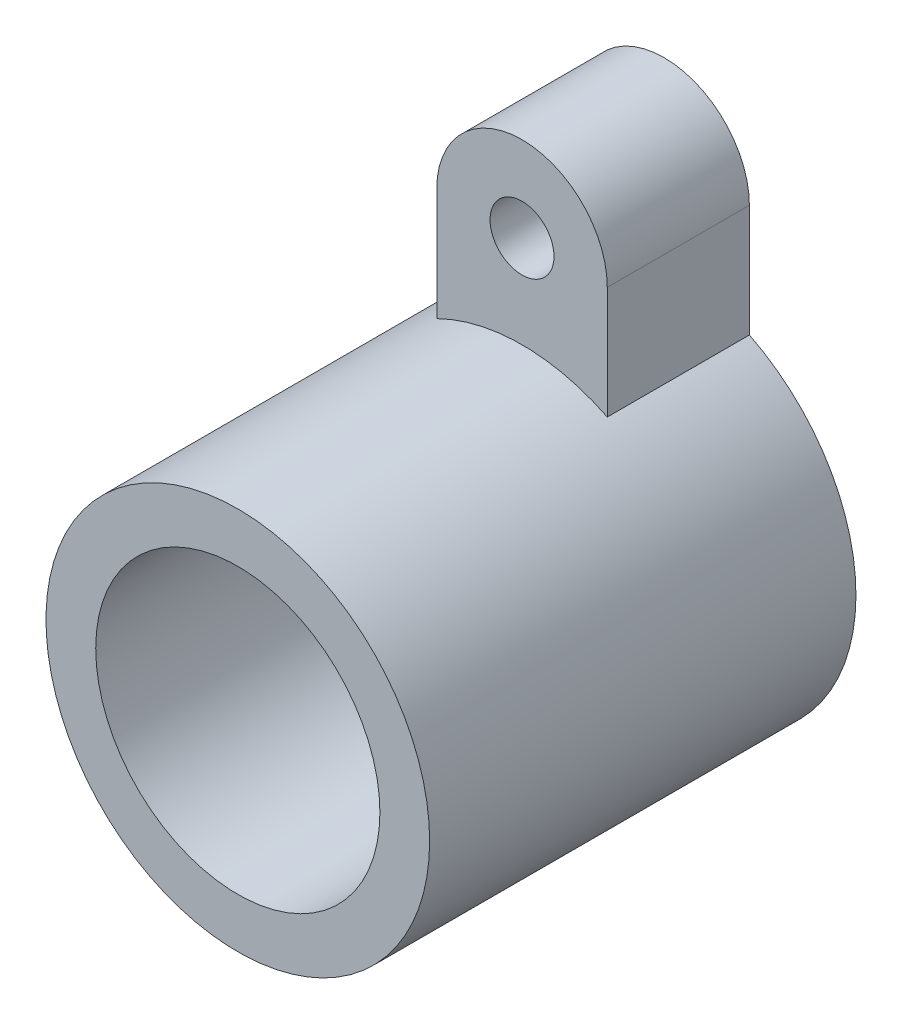
ISO-10303-21;
HEADER;
FILE_DESCRIPTION(('STEP AP214'),'2;1');
FILE_NAME('part.step','',(''),(''),'','','');
FILE_SCHEMA(('AUTOMOTIVE_DESIGN { 1 0 10303 214 1 1 1 1 }'));
ENDSEC;
DATA;
#1=APPLICATION_CONTEXT('core data for automotive mechanical design processes');
#2=APPLICATION_PROTOCOL_DEFINITION('international standard','automotive_design',2000,#1);
#3=PRODUCT_CONTEXT('',#1,'mechanical');
#4=PRODUCT('Part','Part','',(#3));
#5=PRODUCT_RELATED_PRODUCT_CATEGORY('part','',(#4));
#6=PRODUCT_DEFINITION_FORMATION('','',#4);
#7=PRODUCT_DEFINITION_CONTEXT('part definition',#1,'design');
#8=PRODUCT_DEFINITION('design','',#6,#7);
#9=PRODUCT_DEFINITION_SHAPE('','',#8);
#10=(LENGTH_UNIT() NAMED_UNIT(*) SI_UNIT(.MILLI.,.METRE.));
#11=(NAMED_UNIT(*) PLANE_ANGLE_UNIT() SI_UNIT($,.RADIAN.));
#12=(NAMED_UNIT(*) SI_UNIT($,.STERADIAN.) SOLID_ANGLE_UNIT());
#13=UNCERTAINTY_MEASURE_WITH_UNIT(LENGTH_MEASURE(1.E-05),#10,'distance_accuracy_value','');
#14=(GEOMETRIC_REPRESENTATION_CONTEXT(3) GLOBAL_UNCERTAINTY_ASSIGNED_CONTEXT((#13)) GLOBAL_UNIT_ASSIGNED_CONTEXT((#10,
#11,#12)) REPRESENTATION_CONTEXT('',''));
#15=CARTESIAN_POINT('',(0.,0.,0.));
#16=DIRECTION('',(0.,0.,1.));
#17=DIRECTION('',(1.,0.,0.));
#18=AXIS2_PLACEMENT_3D('',#15,#16,#17);
#19=CARTESIAN_POINT('',(0.,0.,60.));
#20=DIRECTION('',(0.,0.,-1.));
#21=DIRECTION('',(-1.,0.,0.));
#22=AXIS2_PLACEMENT_3D('',#19,#20,#21);
#23=CYLINDRICAL_SURFACE('',#22,27.);
#24=CARTESIAN_POINT('',(0.,0.,60.));
#25=DIRECTION('',(0.,0.,1.));
#26=DIRECTION('',(1.,0.,0.));
#27=AXIS2_PLACEMENT_3D('',#24,#25,#26);
#28=CIRCLE('',#27,27.);
#29=CARTESIAN_POINT('',(27.,0.,60.));
#30=VERTEX_POINT('',#29);
#31=EDGE_CURVE('E45',#30,#30,#28,.T.);
#32=ORIENTED_EDGE('',*,*,#31,.F.);
#33=EDGE_LOOP('',(#32));
#34=FACE_BOUND('',#33,.T.);
#35=DIRECTION('',(0.,0.,-1.));
#36=VECTOR('',#35,1.);
#37=CARTESIAN_POINT('',(12.,24.1867732448956,20.));
#38=LINE('',#37,#36);
#39=CARTESIAN_POINT('',(12.,24.1867732448956,20.));
#40=VERTEX_POINT('',#39);
#41=CARTESIAN_POINT('',(12.,24.1867732448956,0.));
#42=VERTEX_POINT('',#41);
#43=EDGE_CURVE('E58',#40,#42,#38,.T.);
#44=ORIENTED_EDGE('',*,*,#43,.F.);
#45=CARTESIAN_POINT('',(0.,0.,20.));
#46=DIRECTION('',(0.,0.,1.));
#47=DIRECTION('',(1.,0.,0.));
#48=AXIS2_PLACEMENT_3D('',#45,#46,#47);
#49=CIRCLE('',#48,27.);
#50=CARTESIAN_POINT('',(-12.,24.1867732448956,20.));
#51=VERTEX_POINT('',#50);
#52=EDGE_CURVE('E53',#40,#51,#49,.T.);
#53=ORIENTED_EDGE('',*,*,#52,.T.);
#54=DIRECTION('',(0.,0.,-1.));
#55=VECTOR('',#54,1.);
#56=CARTESIAN_POINT('',(-12.,24.1867732448956,20.));
#57=LINE('',#56,#55);
#58=CARTESIAN_POINT('',(-12.,24.1867732448956,0.));
#59=VERTEX_POINT('',#58);
#60=EDGE_CURVE('E131',#51,#59,#57,.T.);
#61=ORIENTED_EDGE('',*,*,#60,.T.);
#62=CARTESIAN_POINT('',(0.,0.,0.));
#63=DIRECTION('',(0.,0.,1.));
#64=DIRECTION('',(1.,0.,0.));
#65=AXIS2_PLACEMENT_3D('',#62,#63,#64);
#66=CIRCLE('',#65,27.);
#67=CARTESIAN_POINT('',(-24.8052156628336,-10.6630800391029,0.));
#68=VERTEX_POINT('',#67);
#69=EDGE_CURVE('E179',#59,#68,#66,.T.);
#70=ORIENTED_EDGE('',*,*,#69,.T.);
#71=DIRECTION('',(0.,0.,-1.));
#72=VECTOR('',#71,1.);
#73=CARTESIAN_POINT('',(-24.8052156628336,-10.6630800391029,20.));
#74=LINE('',#73,#72);
#75=CARTESIAN_POINT('',(-24.8052156628336,-10.6630800391029,20.));
#76=VERTEX_POINT('',#75);
#77=EDGE_CURVE('E159',#76,#68,#74,.T.);
#78=ORIENTED_EDGE('',*,*,#77,.F.);
#79=CARTESIAN_POINT('',(0.,0.,20.));
#80=DIRECTION('',(0.,0.,1.));
#81=DIRECTION('',(1.,0.,0.));
#82=AXIS2_PLACEMENT_3D('',#79,#80,#81);
#83=CIRCLE('',#82,27.);
#84=CARTESIAN_POINT('',(-10.6630800391026,-24.8052156628337,20.));
#85=VERTEX_POINT('',#84);
#86=EDGE_CURVE('E154',#76,#85,#83,.T.);
#87=ORIENTED_EDGE('',*,*,#86,.T.);
#88=DIRECTION('',(0.,0.,-1.));
#89=VECTOR('',#88,1.);
#90=CARTESIAN_POINT('',(-10.6630800391026,-24.8052156628337,20.));
#91=LINE('',#90,#89);
#92=CARTESIAN_POINT('',(-10.6630800391026,-24.8052156628337,0.));
#93=VERTEX_POINT('',#92);
#94=EDGE_CURVE('E171',#85,#93,#91,.T.);
#95=ORIENTED_EDGE('',*,*,#94,.T.);
#96=EDGE_CURVE('E181',#93,#42,#66,.T.);
#97=ORIENTED_EDGE('',*,*,#96,.T.);
#98=EDGE_LOOP('',(#44,#53,#61,#70,#78,#87,#95,#97));
#99=FACE_BOUND('',#98,.T.);
#100=ADVANCED_FACE('F37',(#34,#99),#23,.T.);
#101=CARTESIAN_POINT('',(0.,0.,60.));
#102=DIRECTION('',(0.,0.,-1.));
#103=DIRECTION('',(-1.,0.,0.));
#104=AXIS2_PLACEMENT_3D('',#101,#102,#103);
#105=CYLINDRICAL_SURFACE('',#104,20.);
#106=CARTESIAN_POINT('',(0.,0.,60.));
#107=DIRECTION('',(0.,0.,1.));
#108=DIRECTION('',(1.,0.,0.));
#109=AXIS2_PLACEMENT_3D('',#106,#107,#108);
#110=CIRCLE('',#109,20.);
#111=CARTESIAN_POINT('',(20.,0.,60.));
#112=VERTEX_POINT('',#111);
#113=EDGE_CURVE('E11',#112,#112,#110,.T.);
#114=ORIENTED_EDGE('',*,*,#113,.T.);
#115=EDGE_LOOP('',(#114));
#116=FACE_BOUND('',#115,.T.);
#117=CARTESIAN_POINT('',(0.,0.,0.));
#118=DIRECTION('',(0.,0.,1.));
#119=DIRECTION('',(1.,0.,0.));
#120=AXIS2_PLACEMENT_3D('',#117,#118,#119);
#121=CIRCLE('',#120,20.);
#122=CARTESIAN_POINT('',(20.,0.,0.));
#123=VERTEX_POINT('',#122);
#124=EDGE_CURVE('E40',#123,#123,#121,.T.);
#125=ORIENTED_EDGE('',*,*,#124,.F.);
#126=EDGE_LOOP('',(#125));
#127=FACE_BOUND('',#126,.T.);
#128=ADVANCED_FACE('F234',(#116,#127),#105,.F.);
#129=CARTESIAN_POINT('',(0.,0.,60.));
#130=DIRECTION('',(0.,0.,1.));
#131=DIRECTION('',(1.,0.,0.));
#132=AXIS2_PLACEMENT_3D('',#129,#130,#131);
#133=PLANE('',#132);
#134=ORIENTED_EDGE('',*,*,#31,.T.);
#135=EDGE_LOOP('',(#134));
#136=FACE_BOUND('',#135,.T.);
#137=ORIENTED_EDGE('',*,*,#113,.F.);
#138=EDGE_LOOP('',(#137));
#139=FACE_BOUND('',#138,.T.);
#140=ADVANCED_FACE('F217',(#136,#139),#133,.T.);
#141=CARTESIAN_POINT('',(0.,0.,0.));
#142=DIRECTION('',(0.,0.,1.));
#143=DIRECTION('',(1.,0.,0.));
#144=AXIS2_PLACEMENT_3D('',#141,#142,#143);
#145=PLANE('',#144);
#146=ORIENTED_EDGE('',*,*,#96,.F.);
#147=DIRECTION('',(0.707106781186544,0.707106781186551,0.));
#148=VECTOR('',#147,1.);
#149=CARTESIAN_POINT('',(7.07106781186552,-7.07106781186545,0.));
#150=LINE('',#149,#148);
#151=CARTESIAN_POINT('',(-24.7487373415289,-38.8908729652603,0.));
#152=VERTEX_POINT('',#151);
#153=EDGE_CURVE('E164',#152,#93,#150,.T.);
#154=ORIENTED_EDGE('',*,*,#153,.F.);
#155=CARTESIAN_POINT('',(-31.8198051533945,-31.8198051533948,0.));
#156=DIRECTION('',(0.,0.,1.));
#157=DIRECTION('',(1.,0.,0.));
#158=AXIS2_PLACEMENT_3D('',#155,#156,#157);
#159=CIRCLE('',#158,10.);
#160=CARTESIAN_POINT('',(-38.89087296526,-24.7487373415294,0.));
#161=VERTEX_POINT('',#160);
#162=EDGE_CURVE('E162',#161,#152,#159,.T.);
#163=ORIENTED_EDGE('',*,*,#162,.F.);
#164=DIRECTION('',(0.707106781186543,0.707106781186552,0.));
#165=VECTOR('',#164,1.);
#166=CARTESIAN_POINT('',(-7.07106781186552,7.07106781186544,0.));
#167=LINE('',#166,#165);
#168=EDGE_CURVE('E144',#161,#68,#167,.T.);
#169=ORIENTED_EDGE('',*,*,#168,.T.);
#170=ORIENTED_EDGE('',*,*,#69,.F.);
#171=DIRECTION('',(0.,1.,0.));
#172=VECTOR('',#171,1.);
#173=CARTESIAN_POINT('',(-12.,0.,0.));
#174=LINE('',#173,#172);
#175=CARTESIAN_POINT('',(-12.,40.,0.));
#176=VERTEX_POINT('',#175);
#177=EDGE_CURVE('E135',#59,#176,#174,.T.);
#178=ORIENTED_EDGE('',*,*,#177,.T.);
#179=CARTESIAN_POINT('',(0.,40.,0.));
#180=DIRECTION('',(0.,0.,1.));
#181=DIRECTION('',(1.,0.,0.));
#182=AXIS2_PLACEMENT_3D('',#179,#180,#181);
#183=CIRCLE('',#182,12.);
#184=CARTESIAN_POINT('',(12.,40.,0.));
#185=VERTEX_POINT('',#184);
#186=EDGE_CURVE('E133',#185,#176,#183,.T.);
#187=ORIENTED_EDGE('',*,*,#186,.F.);
#188=DIRECTION('',(0.,1.,0.));
#189=VECTOR('',#188,1.);
#190=CARTESIAN_POINT('',(12.,0.,0.));
#191=LINE('',#190,#189);
#192=EDGE_CURVE('E115',#42,#185,#191,.T.);
#193=ORIENTED_EDGE('',*,*,#192,.F.);
#194=EDGE_LOOP('',(#146,#154,#163,#169,#170,#178,#187,#193));
#195=FACE_BOUND('',#194,.T.);
#196=ORIENTED_EDGE('',*,*,#124,.T.);
#197=EDGE_LOOP('',(#196));
#198=FACE_BOUND('',#197,.T.);
#199=CARTESIAN_POINT('',(-31.8198051533945,-31.8198051533948,0.));
#200=DIRECTION('',(0.,0.,1.));
#201=DIRECTION('',(1.,0.,0.));
#202=AXIS2_PLACEMENT_3D('',#199,#200,#201);
#203=CIRCLE('',#202,4.);
#204=CARTESIAN_POINT('',(-27.8198051533945,-31.8198051533948,0.));
#205=VERTEX_POINT('',#204);
#206=EDGE_CURVE('E149',#205,#205,#203,.T.);
#207=ORIENTED_EDGE('',*,*,#206,.T.);
#208=EDGE_LOOP('',(#207));
#209=FACE_BOUND('',#208,.T.);
#210=CARTESIAN_POINT('',(0.,40.,0.));
#211=DIRECTION('',(0.,0.,1.));
#212=DIRECTION('',(1.,0.,0.));
#213=AXIS2_PLACEMENT_3D('',#210,#211,#212);
#214=CIRCLE('',#213,4.5);
#215=CARTESIAN_POINT('',(4.5,40.,0.));
#216=VERTEX_POINT('',#215);
#217=EDGE_CURVE('E138',#216,#216,#214,.T.);
#218=ORIENTED_EDGE('',*,*,#217,.T.);
#219=EDGE_LOOP('',(#218));
#220=FACE_BOUND('',#219,.T.);
#221=ADVANCED_FACE('F191',(#195,#198,#209,#220),#145,.F.);
#222=CARTESIAN_POINT('',(-7.07106781186552,7.07106781186544,20.));
#223=DIRECTION('',(-0.707106781186552,0.707106781186543,0.));
#224=DIRECTION('',(-0.707106781186543,-0.707106781186552,0.));
#225=AXIS2_PLACEMENT_3D('',#222,#223,#224);
#226=PLANE('',#225);
#227=ORIENTED_EDGE('',*,*,#168,.F.);
#228=DIRECTION('',(0.,0.,-1.));
#229=VECTOR('',#228,1.);
#230=CARTESIAN_POINT('',(-38.89087296526,-24.7487373415294,20.));
#231=LINE('',#230,#229);
#232=CARTESIAN_POINT('',(-38.89087296526,-24.7487373415294,20.));
#233=VERTEX_POINT('',#232);
#234=EDGE_CURVE('E177',#233,#161,#231,.T.);
#235=ORIENTED_EDGE('',*,*,#234,.F.);
#236=DIRECTION('',(0.707106781186543,0.707106781186552,0.));
#237=VECTOR('',#236,1.);
#238=CARTESIAN_POINT('',(-7.07106781186552,7.07106781186544,20.));
#239=LINE('',#238,#237);
#240=EDGE_CURVE('E145',#233,#76,#239,.T.);
#241=ORIENTED_EDGE('',*,*,#240,.T.);
#242=ORIENTED_EDGE('',*,*,#77,.T.);
#243=EDGE_LOOP('',(#227,#235,#241,#242));
#244=FACE_BOUND('',#243,.T.);
#245=ADVANCED_FACE('F187',(#244),#226,.T.);
#246=CARTESIAN_POINT('',(-31.8198051533945,-31.8198051533948,20.));
#247=DIRECTION('',(0.,0.,-1.));
#248=DIRECTION('',(-1.,0.,0.));
#249=AXIS2_PLACEMENT_3D('',#246,#247,#248);
#250=CYLINDRICAL_SURFACE('',#249,10.);
#251=ORIENTED_EDGE('',*,*,#162,.T.);
#252=DIRECTION('',(0.,0.,-1.));
#253=VECTOR('',#252,1.);
#254=CARTESIAN_POINT('',(-24.7487373415289,-38.8908729652603,20.));
#255=LINE('',#254,#253);
#256=CARTESIAN_POINT('',(-24.7487373415289,-38.8908729652603,20.));
#257=VERTEX_POINT('',#256);
#258=EDGE_CURVE('E174',#257,#152,#255,.T.);
#259=ORIENTED_EDGE('',*,*,#258,.F.);
#260=CARTESIAN_POINT('',(-31.8198051533945,-31.8198051533948,20.));
#261=DIRECTION('',(0.,0.,1.));
#262=DIRECTION('',(1.,0.,0.));
#263=AXIS2_PLACEMENT_3D('',#260,#261,#262);
#264=CIRCLE('',#263,10.);
#265=EDGE_CURVE('E148',#233,#257,#264,.T.);
#266=ORIENTED_EDGE('',*,*,#265,.F.);
#267=ORIENTED_EDGE('',*,*,#234,.T.);
#268=EDGE_LOOP('',(#251,#259,#266,#267));
#269=FACE_BOUND('',#268,.T.);
#270=ADVANCED_FACE('F196',(#269),#250,.T.);
#271=CARTESIAN_POINT('',(7.07106781186552,-7.07106781186545,20.));
#272=DIRECTION('',(-0.707106781186551,0.707106781186544,0.));
#273=DIRECTION('',(-0.707106781186544,-0.707106781186551,0.));
#274=AXIS2_PLACEMENT_3D('',#271,#272,#273);
#275=PLANE('',#274);
#276=ORIENTED_EDGE('',*,*,#153,.T.);
#277=ORIENTED_EDGE('',*,*,#94,.F.);
#278=DIRECTION('',(0.707106781186544,0.707106781186551,0.));
#279=VECTOR('',#278,1.);
#280=CARTESIAN_POINT('',(7.07106781186552,-7.07106781186545,20.));
#281=LINE('',#280,#279);
#282=EDGE_CURVE('E151',#257,#85,#281,.T.);
#283=ORIENTED_EDGE('',*,*,#282,.F.);
#284=ORIENTED_EDGE('',*,*,#258,.T.);
#285=EDGE_LOOP('',(#276,#277,#283,#284));
#286=FACE_BOUND('',#285,.T.);
#287=ADVANCED_FACE('F200',(#286),#275,.F.);
#288=CARTESIAN_POINT('',(-31.8198051533945,-31.8198051533948,20.));
#289=DIRECTION('',(0.,0.,-1.));
#290=DIRECTION('',(-1.,0.,0.));
#291=AXIS2_PLACEMENT_3D('',#288,#289,#290);
#292=CYLINDRICAL_SURFACE('',#291,4.);
#293=CARTESIAN_POINT('',(-31.8198051533945,-31.8198051533948,20.));
#294=DIRECTION('',(0.,0.,1.));
#295=DIRECTION('',(1.,0.,0.));
#296=AXIS2_PLACEMENT_3D('',#293,#294,#295);
#297=CIRCLE('',#296,4.);
#298=CARTESIAN_POINT('',(-27.8198051533945,-31.8198051533948,20.));
#299=VERTEX_POINT('',#298);
#300=EDGE_CURVE('E156',#299,#299,#297,.T.);
#301=ORIENTED_EDGE('',*,*,#300,.T.);
#302=EDGE_LOOP('',(#301));
#303=FACE_BOUND('',#302,.T.);
#304=ORIENTED_EDGE('',*,*,#206,.F.);
#305=EDGE_LOOP('',(#304));
#306=FACE_BOUND('',#305,.T.);
#307=ADVANCED_FACE('F206',(#303,#306),#292,.F.);
#308=CARTESIAN_POINT('',(0.,0.,20.));
#309=DIRECTION('',(0.,0.,1.));
#310=DIRECTION('',(1.,0.,0.));
#311=AXIS2_PLACEMENT_3D('',#308,#309,#310);
#312=PLANE('',#311);
#313=ORIENTED_EDGE('',*,*,#240,.F.);
#314=ORIENTED_EDGE('',*,*,#265,.T.);
#315=ORIENTED_EDGE('',*,*,#282,.T.);
#316=ORIENTED_EDGE('',*,*,#86,.F.);
#317=EDGE_LOOP('',(#313,#314,#315,#316));
#318=FACE_BOUND('',#317,.T.);
#319=ORIENTED_EDGE('',*,*,#300,.F.);
#320=EDGE_LOOP('',(#319));
#321=FACE_BOUND('',#320,.T.);
#322=ADVANCED_FACE('F203',(#318,#321),#312,.T.);
#323=CARTESIAN_POINT('',(12.,0.,20.));
#324=DIRECTION('',(-1.,0.,0.));
#325=DIRECTION('',(0.,-1.,0.));
#326=AXIS2_PLACEMENT_3D('',#323,#324,#325);
#327=PLANE('',#326);
#328=ORIENTED_EDGE('',*,*,#192,.T.);
#329=DIRECTION('',(0.,0.,-1.));
#330=VECTOR('',#329,1.);
#331=CARTESIAN_POINT('',(12.,40.,20.));
#332=LINE('',#331,#330);
#333=CARTESIAN_POINT('',(12.,40.,20.));
#334=VERTEX_POINT('',#333);
#335=EDGE_CURVE('E112',#334,#185,#332,.T.);
#336=ORIENTED_EDGE('',*,*,#335,.F.);
#337=DIRECTION('',(0.,1.,0.));
#338=VECTOR('',#337,1.);
#339=CARTESIAN_POINT('',(12.,0.,20.));
#340=LINE('',#339,#338);
#341=EDGE_CURVE('E101',#40,#334,#340,.T.);
#342=ORIENTED_EDGE('',*,*,#341,.F.);
#343=ORIENTED_EDGE('',*,*,#43,.T.);
#344=EDGE_LOOP('',(#328,#336,#342,#343));
#345=FACE_BOUND('',#344,.T.);
#346=ADVANCED_FACE('F113',(#345),#327,.F.);
#347=CARTESIAN_POINT('',(0.,40.,20.));
#348=DIRECTION('',(0.,0.,-1.));
#349=DIRECTION('',(-1.,0.,0.));
#350=AXIS2_PLACEMENT_3D('',#347,#348,#349);
#351=CYLINDRICAL_SURFACE('',#350,12.);
#352=ORIENTED_EDGE('',*,*,#186,.T.);
#353=DIRECTION('',(0.,0.,-1.));
#354=VECTOR('',#353,1.);
#355=CARTESIAN_POINT('',(-12.,40.,20.));
#356=LINE('',#355,#354);
#357=CARTESIAN_POINT('',(-12.,40.,20.));
#358=VERTEX_POINT('',#357);
#359=EDGE_CURVE('E119',#358,#176,#356,.T.);
#360=ORIENTED_EDGE('',*,*,#359,.F.);
#361=CARTESIAN_POINT('',(0.,40.,20.));
#362=DIRECTION('',(0.,0.,1.));
#363=DIRECTION('',(1.,0.,0.));
#364=AXIS2_PLACEMENT_3D('',#361,#362,#363);
#365=CIRCLE('',#364,12.);
#366=EDGE_CURVE('E107',#334,#358,#365,.T.);
#367=ORIENTED_EDGE('',*,*,#366,.F.);
#368=ORIENTED_EDGE('',*,*,#335,.T.);
#369=EDGE_LOOP('',(#352,#360,#367,#368));
#370=FACE_BOUND('',#369,.T.);
#371=ADVANCED_FACE('F121',(#370),#351,.T.);
#372=CARTESIAN_POINT('',(-12.,0.,20.));
#373=DIRECTION('',(-1.,0.,0.));
#374=DIRECTION('',(0.,0.,1.));
#375=AXIS2_PLACEMENT_3D('',#372,#373,#374);
#376=PLANE('',#375);
#377=ORIENTED_EDGE('',*,*,#177,.F.);
#378=ORIENTED_EDGE('',*,*,#60,.F.);
#379=DIRECTION('',(0.,1.,0.));
#380=VECTOR('',#379,1.);
#381=CARTESIAN_POINT('',(-12.,0.,20.));
#382=LINE('',#381,#380);
#383=EDGE_CURVE('E123',#51,#358,#382,.T.);
#384=ORIENTED_EDGE('',*,*,#383,.T.);
#385=ORIENTED_EDGE('',*,*,#359,.T.);
#386=EDGE_LOOP('',(#377,#378,#384,#385));
#387=FACE_BOUND('',#386,.T.);
#388=ADVANCED_FACE('F223',(#387),#376,.T.);
#389=CARTESIAN_POINT('',(0.,40.,20.));
#390=DIRECTION('',(0.,0.,-1.));
#391=DIRECTION('',(-1.,0.,0.));
#392=AXIS2_PLACEMENT_3D('',#389,#390,#391);
#393=CYLINDRICAL_SURFACE('',#392,4.5);
#394=CARTESIAN_POINT('',(0.,40.,20.));
#395=DIRECTION('',(0.,0.,1.));
#396=DIRECTION('',(1.,0.,0.));
#397=AXIS2_PLACEMENT_3D('',#394,#395,#396);
#398=CIRCLE('',#397,4.5);
#399=CARTESIAN_POINT('',(4.5,40.,20.));
#400=VERTEX_POINT('',#399);
#401=EDGE_CURVE('E125',#400,#400,#398,.T.);
#402=ORIENTED_EDGE('',*,*,#401,.T.);
#403=EDGE_LOOP('',(#402));
#404=FACE_BOUND('',#403,.T.);
#405=ORIENTED_EDGE('',*,*,#217,.F.);
#406=EDGE_LOOP('',(#405));
#407=FACE_BOUND('',#406,.T.);
#408=ADVANCED_FACE('F221',(#404,#407),#393,.F.);
#409=CARTESIAN_POINT('',(0.,0.,20.));
#410=DIRECTION('',(0.,0.,1.));
#411=DIRECTION('',(1.,0.,0.));
#412=AXIS2_PLACEMENT_3D('',#409,#410,#411);
#413=PLANE('',#412);
#414=ORIENTED_EDGE('',*,*,#52,.F.);
#415=ORIENTED_EDGE('',*,*,#341,.T.);
#416=ORIENTED_EDGE('',*,*,#366,.T.);
#417=ORIENTED_EDGE('',*,*,#383,.F.);
#418=EDGE_LOOP('',(#414,#415,#416,#417));
#419=FACE_BOUND('',#418,.T.);
#420=ORIENTED_EDGE('',*,*,#401,.F.);
#421=EDGE_LOOP('',(#420));
#422=FACE_BOUND('',#421,.T.);
#423=ADVANCED_FACE('F103',(#419,#422),#413,.T.);
#424=CLOSED_SHELL('',(#100,#128,#140,#221,#245,#270,#287,#307,#322,#346,#371,#388,#408,#423));
#425=MANIFOLD_SOLID_BREP('B2',#424);
#426=ADVANCED_BREP_SHAPE_REPRESENTATION('',(#18,#425),#14);
#427=SHAPE_DEFINITION_REPRESENTATION(#9,#426);
ENDSEC;
END-ISO-10303-21;
